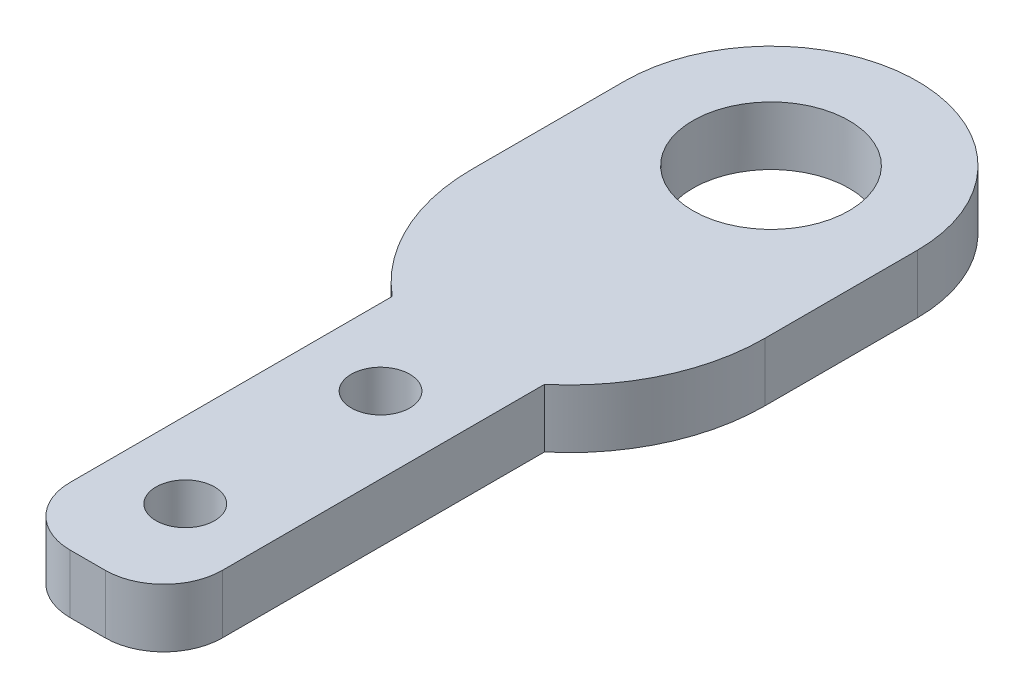
ISO-10303-21;
HEADER;
FILE_DESCRIPTION(('STEP AP214'),'2;1');
FILE_NAME('part.step','',(''),(''),'','','');
FILE_SCHEMA(('AUTOMOTIVE_DESIGN { 1 0 10303 214 1 1 1 1 }'));
ENDSEC;
DATA;
#1=APPLICATION_CONTEXT('core data for automotive mechanical design processes');
#2=APPLICATION_PROTOCOL_DEFINITION('international standard','automotive_design',2000,#1);
#3=PRODUCT_CONTEXT('',#1,'mechanical');
#4=PRODUCT('Part','Part','',(#3));
#5=PRODUCT_RELATED_PRODUCT_CATEGORY('part','',(#4));
#6=PRODUCT_DEFINITION_FORMATION('','',#4);
#7=PRODUCT_DEFINITION_CONTEXT('part definition',#1,'design');
#8=PRODUCT_DEFINITION('design','',#6,#7);
#9=PRODUCT_DEFINITION_SHAPE('','',#8);
#10=(LENGTH_UNIT() NAMED_UNIT(*) SI_UNIT(.MILLI.,.METRE.));
#11=(NAMED_UNIT(*) PLANE_ANGLE_UNIT() SI_UNIT($,.RADIAN.));
#12=(NAMED_UNIT(*) SI_UNIT($,.STERADIAN.) SOLID_ANGLE_UNIT());
#13=UNCERTAINTY_MEASURE_WITH_UNIT(LENGTH_MEASURE(1.E-05),#10,'distance_accuracy_value','');
#14=(GEOMETRIC_REPRESENTATION_CONTEXT(3) GLOBAL_UNCERTAINTY_ASSIGNED_CONTEXT((#13)) GLOBAL_UNIT_ASSIGNED_CONTEXT((#10,
#11,#12)) REPRESENTATION_CONTEXT('',''));
#15=CARTESIAN_POINT('',(0.,0.,0.));
#16=DIRECTION('',(0.,0.,1.));
#17=DIRECTION('',(1.,0.,0.));
#18=AXIS2_PLACEMENT_3D('',#15,#16,#17);
#19=CARTESIAN_POINT('',(0.,3.,-29.));
#20=DIRECTION('',(0.,-1.,0.));
#21=DIRECTION('',(0.,0.,-1.));
#22=AXIS2_PLACEMENT_3D('',#19,#20,#21);
#23=CYLINDRICAL_SURFACE('',#22,7.5);
#24=CARTESIAN_POINT('',(0.,0.,-29.));
#25=DIRECTION('',(0.,1.,0.));
#26=DIRECTION('',(0.,0.,-1.));
#27=AXIS2_PLACEMENT_3D('',#24,#25,#26);
#28=CIRCLE('',#27,7.5);
#29=CARTESIAN_POINT('',(7.5,0.,-29.));
#30=VERTEX_POINT('',#29);
#31=CARTESIAN_POINT('',(-7.5,0.,-29.));
#32=VERTEX_POINT('',#31);
#33=EDGE_CURVE('E197',#30,#32,#28,.T.);
#34=ORIENTED_EDGE('',*,*,#33,.T.);
#35=DIRECTION('',(0.,-1.,0.));
#36=VECTOR('',#35,1.);
#37=CARTESIAN_POINT('',(-7.5,3.,-29.));
#38=LINE('',#37,#36);
#39=CARTESIAN_POINT('',(-7.5,3.,-29.));
#40=VERTEX_POINT('',#39);
#41=EDGE_CURVE('E209',#40,#32,#38,.T.);
#42=ORIENTED_EDGE('',*,*,#41,.F.);
#43=CARTESIAN_POINT('',(0.,3.,-29.));
#44=DIRECTION('',(0.,1.,0.));
#45=DIRECTION('',(0.,0.,-1.));
#46=AXIS2_PLACEMENT_3D('',#43,#44,#45);
#47=CIRCLE('',#46,7.5);
#48=CARTESIAN_POINT('',(7.5,3.,-29.));
#49=VERTEX_POINT('',#48);
#50=EDGE_CURVE('E184',#49,#40,#47,.T.);
#51=ORIENTED_EDGE('',*,*,#50,.F.);
#52=DIRECTION('',(0.,-1.,0.));
#53=VECTOR('',#52,1.);
#54=CARTESIAN_POINT('',(7.5,3.,-29.));
#55=LINE('',#54,#53);
#56=EDGE_CURVE('E196',#49,#30,#55,.T.);
#57=ORIENTED_EDGE('',*,*,#56,.T.);
#58=EDGE_LOOP('',(#34,#42,#51,#57));
#59=FACE_BOUND('',#58,.T.);
#60=ADVANCED_FACE('F39',(#59),#23,.T.);
#61=CARTESIAN_POINT('',(-7.5,3.,29.));
#62=DIRECTION('',(1.,0.,0.));
#63=DIRECTION('',(0.,0.,-1.));
#64=AXIS2_PLACEMENT_3D('',#61,#62,#63);
#65=PLANE('',#64);
#66=DIRECTION('',(0.,0.,1.));
#67=VECTOR('',#66,1.);
#68=CARTESIAN_POINT('',(-7.5,0.,29.));
#69=LINE('',#68,#67);
#70=CARTESIAN_POINT('',(-7.5,0.,-21.1837490849194));
#71=VERTEX_POINT('',#70);
#72=EDGE_CURVE('E201',#32,#71,#69,.T.);
#73=ORIENTED_EDGE('',*,*,#72,.T.);
#74=DIRECTION('',(0.,-1.,0.));
#75=VECTOR('',#74,1.);
#76=CARTESIAN_POINT('',(-7.5,3.,-21.1837490849194));
#77=LINE('',#76,#75);
#78=CARTESIAN_POINT('',(-7.49999999999999,3.,-21.1837490849194));
#79=VERTEX_POINT('',#78);
#80=EDGE_CURVE('E125',#71,#79,#77,.F.);
#81=ORIENTED_EDGE('',*,*,#80,.T.);
#82=DIRECTION('',(0.,0.,1.));
#83=VECTOR('',#82,1.);
#84=CARTESIAN_POINT('',(-7.5,3.,29.));
#85=LINE('',#84,#83);
#86=EDGE_CURVE('E188',#40,#79,#85,.T.);
#87=ORIENTED_EDGE('',*,*,#86,.F.);
#88=ORIENTED_EDGE('',*,*,#41,.T.);
#89=EDGE_LOOP('',(#73,#81,#87,#88));
#90=FACE_BOUND('',#89,.T.);
#91=ADVANCED_FACE('F274',(#90),#65,.F.);
#92=CARTESIAN_POINT('',(7.5,3.,29.));
#93=DIRECTION('',(-1.,0.,0.));
#94=DIRECTION('',(0.,0.,1.));
#95=AXIS2_PLACEMENT_3D('',#92,#93,#94);
#96=PLANE('',#95);
#97=DIRECTION('',(0.,0.,-1.));
#98=VECTOR('',#97,1.);
#99=CARTESIAN_POINT('',(7.5,3.,29.));
#100=LINE('',#99,#98);
#101=CARTESIAN_POINT('',(7.5,3.,-21.1837490849194));
#102=VERTEX_POINT('',#101);
#103=EDGE_CURVE('E193',#102,#49,#100,.T.);
#104=ORIENTED_EDGE('',*,*,#103,.F.);
#105=DIRECTION('',(0.,1.,0.));
#106=VECTOR('',#105,1.);
#107=CARTESIAN_POINT('',(7.5,3.,-21.1837490849194));
#108=LINE('',#107,#106);
#109=CARTESIAN_POINT('',(7.5,0.,-21.1837490849194));
#110=VERTEX_POINT('',#109);
#111=EDGE_CURVE('E129',#102,#110,#108,.F.);
#112=ORIENTED_EDGE('',*,*,#111,.T.);
#113=DIRECTION('',(0.,0.,-1.));
#114=VECTOR('',#113,1.);
#115=CARTESIAN_POINT('',(7.5,0.,29.));
#116=LINE('',#115,#114);
#117=EDGE_CURVE('E189',#110,#30,#116,.T.);
#118=ORIENTED_EDGE('',*,*,#117,.T.);
#119=ORIENTED_EDGE('',*,*,#56,.F.);
#120=EDGE_LOOP('',(#104,#112,#118,#119));
#121=FACE_BOUND('',#120,.T.);
#122=ADVANCED_FACE('F267',(#121),#96,.F.);
#123=CARTESIAN_POINT('',(0.,3.,-29.));
#124=DIRECTION('',(0.,-1.,0.));
#125=DIRECTION('',(0.,0.,-1.));
#126=AXIS2_PLACEMENT_3D('',#123,#124,#125);
#127=PLANE('',#126);
#128=CARTESIAN_POINT('',(0.,3.,1.));
#129=DIRECTION('',(0.,-1.,0.));
#130=DIRECTION('',(0.,0.,-1.));
#131=AXIS2_PLACEMENT_3D('',#128,#129,#130);
#132=CIRCLE('',#131,1.5);
#133=CARTESIAN_POINT('',(0.,3.,-0.499999999999999));
#134=VERTEX_POINT('',#133);
#135=EDGE_CURVE('E164',#134,#134,#132,.T.);
#136=ORIENTED_EDGE('',*,*,#135,.T.);
#137=EDGE_LOOP('',(#136));
#138=FACE_BOUND('',#137,.T.);
#139=CARTESIAN_POINT('',(0.,3.,-9.));
#140=DIRECTION('',(0.,-1.,0.));
#141=DIRECTION('',(0.,0.,-1.));
#142=AXIS2_PLACEMENT_3D('',#139,#140,#141);
#143=CIRCLE('',#142,1.5);
#144=CARTESIAN_POINT('',(0.,3.,-10.5));
#145=VERTEX_POINT('',#144);
#146=EDGE_CURVE('E173',#145,#145,#143,.T.);
#147=ORIENTED_EDGE('',*,*,#146,.T.);
#148=EDGE_LOOP('',(#147));
#149=FACE_BOUND('',#148,.T.);
#150=CARTESIAN_POINT('',(0.,3.,-29.));
#151=DIRECTION('',(0.,1.,0.));
#152=DIRECTION('',(0.,0.,1.));
#153=AXIS2_PLACEMENT_3D('',#150,#151,#152);
#154=CIRCLE('',#153,4.);
#155=CARTESIAN_POINT('',(0.,3.,-25.));
#156=VERTEX_POINT('',#155);
#157=EDGE_CURVE('E168',#156,#156,#154,.T.);
#158=ORIENTED_EDGE('',*,*,#157,.F.);
#159=EDGE_LOOP('',(#158));
#160=FACE_BOUND('',#159,.T.);
#161=DIRECTION('',(-1.,0.,0.));
#162=VECTOR('',#161,1.);
#163=CARTESIAN_POINT('',(-3.89999999999999,3.,6.));
#164=LINE('',#163,#162);
#165=CARTESIAN_POINT('',(0.900000000000005,3.,6.));
#166=VERTEX_POINT('',#165);
#167=CARTESIAN_POINT('',(-0.899999999999992,3.,6.));
#168=VERTEX_POINT('',#167);
#169=EDGE_CURVE('E151',#166,#168,#164,.T.);
#170=ORIENTED_EDGE('',*,*,#169,.F.);
#171=CARTESIAN_POINT('',(0.900000000000005,3.,3.));
#172=DIRECTION('',(0.,-1.,0.));
#173=DIRECTION('',(0.,0.,-1.));
#174=AXIS2_PLACEMENT_3D('',#171,#172,#173);
#175=CIRCLE('',#174,3.);
#176=CARTESIAN_POINT('',(3.90000000000001,3.,3.));
#177=VERTEX_POINT('',#176);
#178=EDGE_CURVE('E240',#166,#177,#175,.F.);
#179=ORIENTED_EDGE('',*,*,#178,.T.);
#180=DIRECTION('',(0.,0.,-1.));
#181=VECTOR('',#180,1.);
#182=CARTESIAN_POINT('',(3.90000000000001,3.,-29.));
#183=LINE('',#182,#181);
#184=CARTESIAN_POINT('',(3.90000000000001,3.,-13.5));
#185=VERTEX_POINT('',#184);
#186=EDGE_CURVE('E160',#177,#185,#183,.T.);
#187=ORIENTED_EDGE('',*,*,#186,.T.);
#188=CARTESIAN_POINT('',(-2.5,3.,-21.1837490849194));
#189=DIRECTION('',(0.,-1.,0.));
#190=DIRECTION('',(0.,0.,-1.));
#191=AXIS2_PLACEMENT_3D('',#188,#189,#190);
#192=CIRCLE('',#191,10.);
#193=EDGE_CURVE('E225',#185,#102,#192,.F.);
#194=ORIENTED_EDGE('',*,*,#193,.T.);
#195=ORIENTED_EDGE('',*,*,#103,.T.);
#196=ORIENTED_EDGE('',*,*,#50,.T.);
#197=ORIENTED_EDGE('',*,*,#86,.T.);
#198=CARTESIAN_POINT('',(2.5,3.,-21.1837490849194));
#199=DIRECTION('',(0.,-1.,0.));
#200=DIRECTION('',(0.,0.,-1.));
#201=AXIS2_PLACEMENT_3D('',#198,#199,#200);
#202=CIRCLE('',#201,10.);
#203=CARTESIAN_POINT('',(-3.89999999999999,3.,-13.5));
#204=VERTEX_POINT('',#203);
#205=EDGE_CURVE('E222',#79,#204,#202,.F.);
#206=ORIENTED_EDGE('',*,*,#205,.T.);
#207=DIRECTION('',(0.,0.,1.));
#208=VECTOR('',#207,1.);
#209=CARTESIAN_POINT('',(-3.89999999999999,3.,-29.));
#210=LINE('',#209,#208);
#211=CARTESIAN_POINT('',(-3.89999999999999,3.,3.));
#212=VERTEX_POINT('',#211);
#213=EDGE_CURVE('E137',#204,#212,#210,.T.);
#214=ORIENTED_EDGE('',*,*,#213,.T.);
#215=CARTESIAN_POINT('',(-0.899999999999992,3.,3.));
#216=DIRECTION('',(0.,-1.,0.));
#217=DIRECTION('',(0.,0.,-1.));
#218=AXIS2_PLACEMENT_3D('',#215,#216,#217);
#219=CIRCLE('',#218,3.);
#220=EDGE_CURVE('E237',#212,#168,#219,.F.);
#221=ORIENTED_EDGE('',*,*,#220,.T.);
#222=EDGE_LOOP('',(#170,#179,#187,#194,#195,#196,#197,#206,#214,#221));
#223=FACE_BOUND('',#222,.T.);
#224=ADVANCED_FACE('F257',(#138,#149,#160,#223),#127,.F.);
#225=CARTESIAN_POINT('',(0.,0.,-29.));
#226=DIRECTION('',(0.,-1.,0.));
#227=DIRECTION('',(0.,0.,-1.));
#228=AXIS2_PLACEMENT_3D('',#225,#226,#227);
#229=PLANE('',#228);
#230=DIRECTION('',(0.,0.,-1.));
#231=VECTOR('',#230,1.);
#232=CARTESIAN_POINT('',(3.9,0.,26.5));
#233=LINE('',#232,#231);
#234=CARTESIAN_POINT('',(3.90000000000001,0.,3.));
#235=VERTEX_POINT('',#234);
#236=CARTESIAN_POINT('',(3.90000000000001,0.,-13.5));
#237=VERTEX_POINT('',#236);
#238=EDGE_CURVE('E140',#235,#237,#233,.T.);
#239=ORIENTED_EDGE('',*,*,#238,.F.);
#240=CARTESIAN_POINT('',(0.900000000000005,0.,3.));
#241=DIRECTION('',(0.,-1.,0.));
#242=DIRECTION('',(0.,0.,-1.));
#243=AXIS2_PLACEMENT_3D('',#240,#241,#242);
#244=CIRCLE('',#243,3.);
#245=CARTESIAN_POINT('',(0.900000000000005,0.,6.00000000000001));
#246=VERTEX_POINT('',#245);
#247=EDGE_CURVE('E48',#235,#246,#244,.T.);
#248=ORIENTED_EDGE('',*,*,#247,.T.);
#249=DIRECTION('',(1.,0.,0.));
#250=VECTOR('',#249,1.);
#251=CARTESIAN_POINT('',(0.,0.,6.00000000000001));
#252=LINE('',#251,#250);
#253=CARTESIAN_POINT('',(-0.899999999999992,0.,6.00000000000001));
#254=VERTEX_POINT('',#253);
#255=EDGE_CURVE('E145',#254,#246,#252,.T.);
#256=ORIENTED_EDGE('',*,*,#255,.F.);
#257=CARTESIAN_POINT('',(-0.899999999999992,0.,3.));
#258=DIRECTION('',(0.,-1.,0.));
#259=DIRECTION('',(0.,0.,-1.));
#260=AXIS2_PLACEMENT_3D('',#257,#258,#259);
#261=CIRCLE('',#260,3.);
#262=CARTESIAN_POINT('',(-3.89999999999999,0.,3.));
#263=VERTEX_POINT('',#262);
#264=EDGE_CURVE('E55',#254,#263,#261,.T.);
#265=ORIENTED_EDGE('',*,*,#264,.T.);
#266=DIRECTION('',(0.,0.,1.));
#267=VECTOR('',#266,1.);
#268=CARTESIAN_POINT('',(-3.89999999999999,0.,-13.5));
#269=LINE('',#268,#267);
#270=CARTESIAN_POINT('',(-3.89999999999999,0.,-13.5));
#271=VERTEX_POINT('',#270);
#272=EDGE_CURVE('E134',#271,#263,#269,.T.);
#273=ORIENTED_EDGE('',*,*,#272,.F.);
#274=CARTESIAN_POINT('',(2.5,0.,-21.1837490849194));
#275=DIRECTION('',(0.,-1.,0.));
#276=DIRECTION('',(0.,0.,-1.));
#277=AXIS2_PLACEMENT_3D('',#274,#275,#276);
#278=CIRCLE('',#277,10.);
#279=EDGE_CURVE('E120',#271,#71,#278,.T.);
#280=ORIENTED_EDGE('',*,*,#279,.T.);
#281=ORIENTED_EDGE('',*,*,#72,.F.);
#282=ORIENTED_EDGE('',*,*,#33,.F.);
#283=ORIENTED_EDGE('',*,*,#117,.F.);
#284=CARTESIAN_POINT('',(-2.5,0.,-21.1837490849194));
#285=DIRECTION('',(0.,-1.,0.));
#286=DIRECTION('',(0.,0.,-1.));
#287=AXIS2_PLACEMENT_3D('',#284,#285,#286);
#288=CIRCLE('',#287,10.);
#289=EDGE_CURVE('E128',#110,#237,#288,.T.);
#290=ORIENTED_EDGE('',*,*,#289,.T.);
#291=EDGE_LOOP('',(#239,#248,#256,#265,#273,#280,#281,#282,#283,#290));
#292=FACE_BOUND('',#291,.T.);
#293=CARTESIAN_POINT('',(0.,0.,1.));
#294=DIRECTION('',(0.,-1.,0.));
#295=DIRECTION('',(0.,0.,-1.));
#296=AXIS2_PLACEMENT_3D('',#293,#294,#295);
#297=CIRCLE('',#296,1.5);
#298=CARTESIAN_POINT('',(0.,0.,-0.499999999999999));
#299=VERTEX_POINT('',#298);
#300=EDGE_CURVE('E169',#299,#299,#297,.T.);
#301=ORIENTED_EDGE('',*,*,#300,.F.);
#302=EDGE_LOOP('',(#301));
#303=FACE_BOUND('',#302,.T.);
#304=CARTESIAN_POINT('',(0.,0.,-9.));
#305=DIRECTION('',(0.,-1.,0.));
#306=DIRECTION('',(0.,0.,-1.));
#307=AXIS2_PLACEMENT_3D('',#304,#305,#306);
#308=CIRCLE('',#307,1.5);
#309=CARTESIAN_POINT('',(0.,0.,-10.5));
#310=VERTEX_POINT('',#309);
#311=EDGE_CURVE('E163',#310,#310,#308,.T.);
#312=ORIENTED_EDGE('',*,*,#311,.F.);
#313=EDGE_LOOP('',(#312));
#314=FACE_BOUND('',#313,.T.);
#315=CARTESIAN_POINT('',(0.,0.,-29.));
#316=DIRECTION('',(0.,-1.,0.));
#317=DIRECTION('',(0.,0.,-1.));
#318=AXIS2_PLACEMENT_3D('',#315,#316,#317);
#319=CIRCLE('',#318,4.);
#320=CARTESIAN_POINT('',(0.,0.,-33.));
#321=VERTEX_POINT('',#320);
#322=EDGE_CURVE('E183',#321,#321,#319,.T.);
#323=ORIENTED_EDGE('',*,*,#322,.F.);
#324=EDGE_LOOP('',(#323));
#325=FACE_BOUND('',#324,.T.);
#326=ADVANCED_FACE('F142',(#292,#303,#314,#325),#229,.T.);
#327=CARTESIAN_POINT('',(0.,-5.,-29.));
#328=DIRECTION('',(0.,1.,0.));
#329=DIRECTION('',(0.,0.,1.));
#330=AXIS2_PLACEMENT_3D('',#327,#328,#329);
#331=CYLINDRICAL_SURFACE('',#330,4.);
#332=ORIENTED_EDGE('',*,*,#322,.T.);
#333=EDGE_LOOP('',(#332));
#334=FACE_BOUND('',#333,.T.);
#335=ORIENTED_EDGE('',*,*,#157,.T.);
#336=EDGE_LOOP('',(#335));
#337=FACE_BOUND('',#336,.T.);
#338=ADVANCED_FACE('F309',(#334,#337),#331,.F.);
#339=CARTESIAN_POINT('',(0.,3.,-9.));
#340=DIRECTION('',(0.,-1.,0.));
#341=DIRECTION('',(0.,0.,-1.));
#342=AXIS2_PLACEMENT_3D('',#339,#340,#341);
#343=CYLINDRICAL_SURFACE('',#342,1.5);
#344=ORIENTED_EDGE('',*,*,#146,.F.);
#345=EDGE_LOOP('',(#344));
#346=FACE_BOUND('',#345,.T.);
#347=ORIENTED_EDGE('',*,*,#311,.T.);
#348=EDGE_LOOP('',(#347));
#349=FACE_BOUND('',#348,.T.);
#350=ADVANCED_FACE('F305',(#346,#349),#343,.F.);
#351=CARTESIAN_POINT('',(0.,3.,1.));
#352=DIRECTION('',(0.,-1.,0.));
#353=DIRECTION('',(0.,0.,-1.));
#354=AXIS2_PLACEMENT_3D('',#351,#352,#353);
#355=CYLINDRICAL_SURFACE('',#354,1.5);
#356=ORIENTED_EDGE('',*,*,#135,.F.);
#357=EDGE_LOOP('',(#356));
#358=FACE_BOUND('',#357,.T.);
#359=ORIENTED_EDGE('',*,*,#300,.T.);
#360=EDGE_LOOP('',(#359));
#361=FACE_BOUND('',#360,.T.);
#362=ADVANCED_FACE('F300',(#358,#361),#355,.F.);
#363=CARTESIAN_POINT('',(3.9,10.,26.5));
#364=DIRECTION('',(-1.,0.,0.));
#365=DIRECTION('',(0.,0.,1.));
#366=AXIS2_PLACEMENT_3D('',#363,#364,#365);
#367=PLANE('',#366);
#368=ORIENTED_EDGE('',*,*,#186,.F.);
#369=DIRECTION('',(0.,1.,0.));
#370=VECTOR('',#369,1.);
#371=CARTESIAN_POINT('',(3.90000000000001,10.,3.));
#372=LINE('',#371,#370);
#373=EDGE_CURVE('E63',#177,#235,#372,.F.);
#374=ORIENTED_EDGE('',*,*,#373,.T.);
#375=ORIENTED_EDGE('',*,*,#238,.T.);
#376=DIRECTION('',(0.,-1.,0.));
#377=VECTOR('',#376,1.);
#378=CARTESIAN_POINT('',(3.90000000000001,10.,-13.5));
#379=LINE('',#378,#377);
#380=EDGE_CURVE('E139',#185,#237,#379,.T.);
#381=ORIENTED_EDGE('',*,*,#380,.F.);
#382=EDGE_LOOP('',(#368,#374,#375,#381));
#383=FACE_BOUND('',#382,.T.);
#384=ADVANCED_FACE('F259',(#383),#367,.F.);
#385=CARTESIAN_POINT('',(-3.89999999999999,10.,-13.5));
#386=DIRECTION('',(1.,0.,0.));
#387=DIRECTION('',(0.,0.,-1.));
#388=AXIS2_PLACEMENT_3D('',#385,#386,#387);
#389=PLANE('',#388);
#390=ORIENTED_EDGE('',*,*,#272,.T.);
#391=DIRECTION('',(0.,1.,0.));
#392=VECTOR('',#391,1.);
#393=CARTESIAN_POINT('',(-3.89999999999999,10.,3.));
#394=LINE('',#393,#392);
#395=EDGE_CURVE('E11',#263,#212,#394,.T.);
#396=ORIENTED_EDGE('',*,*,#395,.T.);
#397=ORIENTED_EDGE('',*,*,#213,.F.);
#398=DIRECTION('',(0.,-1.,0.));
#399=VECTOR('',#398,1.);
#400=CARTESIAN_POINT('',(-3.89999999999999,10.,-13.5));
#401=LINE('',#400,#399);
#402=EDGE_CURVE('E124',#204,#271,#401,.T.);
#403=ORIENTED_EDGE('',*,*,#402,.T.);
#404=EDGE_LOOP('',(#390,#396,#397,#403));
#405=FACE_BOUND('',#404,.T.);
#406=ADVANCED_FACE('F133',(#405),#389,.F.);
#407=CARTESIAN_POINT('',(-2.5,10.,-21.1837490849194));
#408=DIRECTION('',(0.,1.,0.));
#409=DIRECTION('',(0.,0.,1.));
#410=AXIS2_PLACEMENT_3D('',#407,#408,#409);
#411=CYLINDRICAL_SURFACE('',#410,10.);
#412=ORIENTED_EDGE('',*,*,#193,.F.);
#413=ORIENTED_EDGE('',*,*,#380,.T.);
#414=ORIENTED_EDGE('',*,*,#289,.F.);
#415=ORIENTED_EDGE('',*,*,#111,.F.);
#416=EDGE_LOOP('',(#412,#413,#414,#415));
#417=FACE_BOUND('',#416,.T.);
#418=ADVANCED_FACE('F263',(#417),#411,.T.);
#419=CARTESIAN_POINT('',(2.5,10.,-21.1837490849194));
#420=DIRECTION('',(0.,-1.,0.));
#421=DIRECTION('',(0.,0.,-1.));
#422=AXIS2_PLACEMENT_3D('',#419,#420,#421);
#423=CYLINDRICAL_SURFACE('',#422,10.);
#424=ORIENTED_EDGE('',*,*,#205,.F.);
#425=ORIENTED_EDGE('',*,*,#80,.F.);
#426=ORIENTED_EDGE('',*,*,#279,.F.);
#427=ORIENTED_EDGE('',*,*,#402,.F.);
#428=EDGE_LOOP('',(#424,#425,#426,#427));
#429=FACE_BOUND('',#428,.T.);
#430=ADVANCED_FACE('F123',(#429),#423,.T.);
#431=CARTESIAN_POINT('',(-3.89999999999999,-7.,6.));
#432=DIRECTION('',(0.,0.,-1.));
#433=DIRECTION('',(-1.,0.,0.));
#434=AXIS2_PLACEMENT_3D('',#431,#432,#433);
#435=PLANE('',#434);
#436=ORIENTED_EDGE('',*,*,#255,.T.);
#437=DIRECTION('',(0.,1.,0.));
#438=VECTOR('',#437,1.);
#439=CARTESIAN_POINT('',(0.900000000000005,-7.,6.));
#440=LINE('',#439,#438);
#441=EDGE_CURVE('E233',#246,#166,#440,.T.);
#442=ORIENTED_EDGE('',*,*,#441,.T.);
#443=ORIENTED_EDGE('',*,*,#169,.T.);
#444=DIRECTION('',(0.,1.,0.));
#445=VECTOR('',#444,1.);
#446=CARTESIAN_POINT('',(-0.899999999999992,-7.,6.));
#447=LINE('',#446,#445);
#448=EDGE_CURVE('E230',#168,#254,#447,.F.);
#449=ORIENTED_EDGE('',*,*,#448,.T.);
#450=EDGE_LOOP('',(#436,#442,#443,#449));
#451=FACE_BOUND('',#450,.T.);
#452=ADVANCED_FACE('F251',(#451),#435,.F.);
#453=CARTESIAN_POINT('',(0.900000000000005,-7.,3.));
#454=DIRECTION('',(0.,1.,0.));
#455=DIRECTION('',(0.,0.,1.));
#456=AXIS2_PLACEMENT_3D('',#453,#454,#455);
#457=CYLINDRICAL_SURFACE('',#456,3.);
#458=ORIENTED_EDGE('',*,*,#247,.F.);
#459=ORIENTED_EDGE('',*,*,#373,.F.);
#460=ORIENTED_EDGE('',*,*,#178,.F.);
#461=ORIENTED_EDGE('',*,*,#441,.F.);
#462=EDGE_LOOP('',(#458,#459,#460,#461));
#463=FACE_BOUND('',#462,.T.);
#464=ADVANCED_FACE('F255',(#463),#457,.T.);
#465=CARTESIAN_POINT('',(-0.899999999999992,10.,3.));
#466=DIRECTION('',(0.,1.,0.));
#467=DIRECTION('',(0.,0.,1.));
#468=AXIS2_PLACEMENT_3D('',#465,#466,#467);
#469=CYLINDRICAL_SURFACE('',#468,3.);
#470=ORIENTED_EDGE('',*,*,#264,.F.);
#471=ORIENTED_EDGE('',*,*,#448,.F.);
#472=ORIENTED_EDGE('',*,*,#220,.F.);
#473=ORIENTED_EDGE('',*,*,#395,.F.);
#474=EDGE_LOOP('',(#470,#471,#472,#473));
#475=FACE_BOUND('',#474,.T.);
#476=ADVANCED_FACE('F41',(#475),#469,.T.);
#477=CLOSED_SHELL('',(#60,#91,#122,#224,#326,#338,#350,#362,#384,#406,#418,#430,#452,#464,#476));
#478=MANIFOLD_SOLID_BREP('B2',#477);
#479=ADVANCED_BREP_SHAPE_REPRESENTATION('',(#18,#478),#14);
#480=SHAPE_DEFINITION_REPRESENTATION(#9,#479);
ENDSEC;
END-ISO-10303-21;
